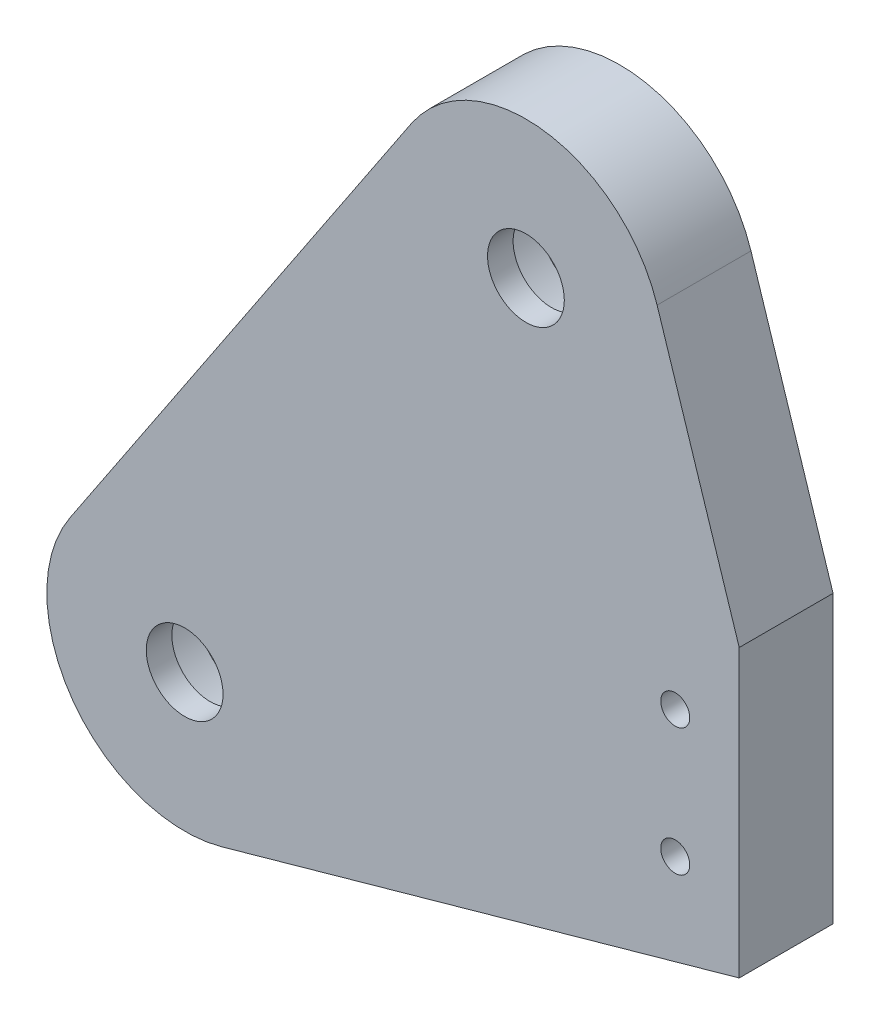
ISO-10303-21;
HEADER;
FILE_DESCRIPTION(('STEP AP214'),'2;1');
FILE_NAME('part.step','',(''),(''),'','','');
FILE_SCHEMA(('AUTOMOTIVE_DESIGN { 1 0 10303 214 1 1 1 1 }'));
ENDSEC;
DATA;
#1=APPLICATION_CONTEXT('core data for automotive mechanical design processes');
#2=APPLICATION_PROTOCOL_DEFINITION('international standard','automotive_design',2000,#1);
#3=PRODUCT_CONTEXT('',#1,'mechanical');
#4=PRODUCT('Part','Part','',(#3));
#5=PRODUCT_RELATED_PRODUCT_CATEGORY('part','',(#4));
#6=PRODUCT_DEFINITION_FORMATION('','',#4);
#7=PRODUCT_DEFINITION_CONTEXT('part definition',#1,'design');
#8=PRODUCT_DEFINITION('design','',#6,#7);
#9=PRODUCT_DEFINITION_SHAPE('','',#8);
#10=(LENGTH_UNIT() NAMED_UNIT(*) SI_UNIT(.MILLI.,.METRE.));
#11=(NAMED_UNIT(*) PLANE_ANGLE_UNIT() SI_UNIT($,.RADIAN.));
#12=(NAMED_UNIT(*) SI_UNIT($,.STERADIAN.) SOLID_ANGLE_UNIT());
#13=UNCERTAINTY_MEASURE_WITH_UNIT(LENGTH_MEASURE(1.E-05),#10,'distance_accuracy_value','');
#14=(GEOMETRIC_REPRESENTATION_CONTEXT(3) GLOBAL_UNCERTAINTY_ASSIGNED_CONTEXT((#13)) GLOBAL_UNIT_ASSIGNED_CONTEXT((#10,
#11,#12)) REPRESENTATION_CONTEXT('',''));
#15=CARTESIAN_POINT('',(0.,0.,0.));
#16=DIRECTION('',(0.,0.,1.));
#17=DIRECTION('',(1.,0.,0.));
#18=AXIS2_PLACEMENT_3D('',#15,#16,#17);
#19=CARTESIAN_POINT('',(55.3751851278346,64.9422851278346,-8.));
#20=DIRECTION('',(0.952023846924741,0.306023846924741,0.));
#21=DIRECTION('',(-0.306023846924741,0.952023846924741,0.));
#22=AXIS2_PLACEMENT_3D('',#19,#20,#21);
#23=PLANE('',#22);
#24=DIRECTION('',(0.,0.,1.));
#25=VECTOR('',#24,1.);
#26=CARTESIAN_POINT('',(55.3751851278346,64.9422851278346,-8.));
#27=LINE('',#26,#25);
#28=CARTESIAN_POINT('',(55.3751851278346,64.9422851278346,-8.));
#29=VERTEX_POINT('',#28);
#30=CARTESIAN_POINT('',(55.3751851278346,64.9422851278346,3.));
#31=VERTEX_POINT('',#30);
#32=EDGE_CURVE('E41',#29,#31,#27,.T.);
#33=ORIENTED_EDGE('',*,*,#32,.T.);
#34=DIRECTION('',(-0.306023846924741,0.952023846924741,0.));
#35=VECTOR('',#34,1.);
#36=CARTESIAN_POINT('',(65.,35.,3.));
#37=LINE('',#36,#35);
#38=CARTESIAN_POINT('',(65.,35.,3.));
#39=VERTEX_POINT('',#38);
#40=EDGE_CURVE('E90',#39,#31,#37,.T.);
#41=ORIENTED_EDGE('',*,*,#40,.F.);
#42=DIRECTION('',(0.,0.,1.));
#43=VECTOR('',#42,1.);
#44=CARTESIAN_POINT('',(65.,35.,-8.));
#45=LINE('',#44,#43);
#46=CARTESIAN_POINT('',(65.,35.,-8.));
#47=VERTEX_POINT('',#46);
#48=EDGE_CURVE('E11',#47,#39,#45,.T.);
#49=ORIENTED_EDGE('',*,*,#48,.F.);
#50=DIRECTION('',(-0.306023846924741,0.952023846924741,0.));
#51=VECTOR('',#50,1.);
#52=CARTESIAN_POINT('',(55.3751851278346,64.9422851278346,-8.));
#53=LINE('',#52,#51);
#54=EDGE_CURVE('E91',#47,#29,#53,.T.);
#55=ORIENTED_EDGE('',*,*,#54,.T.);
#56=EDGE_LOOP('',(#33,#41,#49,#55));
#57=FACE_BOUND('',#56,.T.);
#58=ADVANCED_FACE('F38',(#57),#23,.T.);
#59=CARTESIAN_POINT('',(65.,1.45410217071159,-8.));
#60=DIRECTION('',(1.,0.,0.));
#61=DIRECTION('',(0.,0.,-1.));
#62=AXIS2_PLACEMENT_3D('',#59,#60,#61);
#63=PLANE('',#62);
#64=ORIENTED_EDGE('',*,*,#48,.T.);
#65=DIRECTION('',(0.,1.,0.));
#66=VECTOR('',#65,1.);
#67=CARTESIAN_POINT('',(65.,1.45410217071159,3.));
#68=LINE('',#67,#66);
#69=CARTESIAN_POINT('',(65.,1.45410217071159,3.));
#70=VERTEX_POINT('',#69);
#71=EDGE_CURVE('E109',#70,#39,#68,.T.);
#72=ORIENTED_EDGE('',*,*,#71,.F.);
#73=DIRECTION('',(0.,0.,1.));
#74=VECTOR('',#73,1.);
#75=CARTESIAN_POINT('',(65.,1.45410217071159,-8.));
#76=LINE('',#75,#74);
#77=CARTESIAN_POINT('',(65.,1.45410217071159,-8.));
#78=VERTEX_POINT('',#77);
#79=EDGE_CURVE('E46',#78,#70,#76,.T.);
#80=ORIENTED_EDGE('',*,*,#79,.F.);
#81=DIRECTION('',(0.,1.,0.));
#82=VECTOR('',#81,1.);
#83=CARTESIAN_POINT('',(65.,1.45410217071159,-8.));
#84=LINE('',#83,#82);
#85=EDGE_CURVE('E96',#78,#47,#84,.T.);
#86=ORIENTED_EDGE('',*,*,#85,.T.);
#87=EDGE_LOOP('',(#64,#72,#80,#86));
#88=FACE_BOUND('',#87,.T.);
#89=ADVANCED_FACE('F172',(#88),#63,.T.);
#90=CARTESIAN_POINT('',(4.36052402078439,-15.550187467171,-8.));
#91=DIRECTION('',(0.270001487355071,-0.962859905087988,0.));
#92=DIRECTION('',(0.962859905087988,0.270001487355071,0.));
#93=AXIS2_PLACEMENT_3D('',#90,#91,#92);
#94=PLANE('',#93);
#95=ORIENTED_EDGE('',*,*,#79,.T.);
#96=DIRECTION('',(0.962859905087988,0.270001487355071,0.));
#97=VECTOR('',#96,1.);
#98=CARTESIAN_POINT('',(4.36052402078439,-15.550187467171,3.));
#99=LINE('',#98,#97);
#100=CARTESIAN_POINT('',(4.36052402078439,-15.550187467171,3.));
#101=VERTEX_POINT('',#100);
#102=EDGE_CURVE('E121',#101,#70,#99,.T.);
#103=ORIENTED_EDGE('',*,*,#102,.F.);
#104=DIRECTION('',(0.,0.,1.));
#105=VECTOR('',#104,1.);
#106=CARTESIAN_POINT('',(4.36052402078439,-15.550187467171,-8.));
#107=LINE('',#106,#105);
#108=CARTESIAN_POINT('',(4.36052402078439,-15.550187467171,-8.));
#109=VERTEX_POINT('',#108);
#110=EDGE_CURVE('E155',#109,#101,#107,.T.);
#111=ORIENTED_EDGE('',*,*,#110,.F.);
#112=DIRECTION('',(0.962859905087988,0.270001487355071,0.));
#113=VECTOR('',#112,1.);
#114=CARTESIAN_POINT('',(4.36052402078439,-15.550187467171,-8.));
#115=LINE('',#114,#113);
#116=EDGE_CURVE('E151',#109,#78,#115,.T.);
#117=ORIENTED_EDGE('',*,*,#116,.T.);
#118=EDGE_LOOP('',(#95,#103,#111,#117));
#119=FACE_BOUND('',#118,.T.);
#120=ADVANCED_FACE('F168',(#119),#94,.T.);
#121=CARTESIAN_POINT('',(0.,0.,-8.));
#122=DIRECTION('',(0.,0.,1.));
#123=DIRECTION('',(1.,0.,0.));
#124=AXIS2_PLACEMENT_3D('',#121,#122,#123);
#125=CYLINDRICAL_SURFACE('',#124,16.15);
#126=ORIENTED_EDGE('',*,*,#110,.T.);
#127=CARTESIAN_POINT('',(0.,0.,3.));
#128=DIRECTION('',(0.,0.,1.));
#129=DIRECTION('',(1.,0.,0.));
#130=AXIS2_PLACEMENT_3D('',#127,#128,#129);
#131=CIRCLE('',#130,16.15);
#132=CARTESIAN_POINT('',(-13.4376122535562,8.95840816903745,3.));
#133=VERTEX_POINT('',#132);
#134=EDGE_CURVE('E118',#133,#101,#131,.T.);
#135=ORIENTED_EDGE('',*,*,#134,.F.);
#136=DIRECTION('',(0.,0.,1.));
#137=VECTOR('',#136,1.);
#138=CARTESIAN_POINT('',(-13.4376122535562,8.95840816903745,-8.));
#139=LINE('',#138,#137);
#140=CARTESIAN_POINT('',(-13.4376122535562,8.95840816903745,-8.));
#141=VERTEX_POINT('',#140);
#142=EDGE_CURVE('E157',#141,#133,#139,.T.);
#143=ORIENTED_EDGE('',*,*,#142,.F.);
#144=CARTESIAN_POINT('',(0.,0.,-8.));
#145=DIRECTION('',(0.,0.,1.));
#146=DIRECTION('',(1.,0.,0.));
#147=AXIS2_PLACEMENT_3D('',#144,#145,#146);
#148=CIRCLE('',#147,16.15);
#149=EDGE_CURVE('E148',#141,#109,#148,.T.);
#150=ORIENTED_EDGE('',*,*,#149,.T.);
#151=EDGE_LOOP('',(#126,#135,#143,#150));
#152=FACE_BOUND('',#151,.T.);
#153=ADVANCED_FACE('F165',(#152),#125,.T.);
#154=CARTESIAN_POINT('',(26.5623877464438,68.9584081690375,-8.));
#155=DIRECTION('',(-0.832050294337844,0.554700196225229,0.));
#156=DIRECTION('',(-0.554700196225229,-0.832050294337844,0.));
#157=AXIS2_PLACEMENT_3D('',#154,#155,#156);
#158=PLANE('',#157);
#159=ORIENTED_EDGE('',*,*,#142,.T.);
#160=DIRECTION('',(-0.554700196225229,-0.832050294337844,0.));
#161=VECTOR('',#160,1.);
#162=CARTESIAN_POINT('',(26.5623877464438,68.9584081690375,3.));
#163=LINE('',#162,#161);
#164=CARTESIAN_POINT('',(26.5623877464438,68.9584081690375,3.));
#165=VERTEX_POINT('',#164);
#166=EDGE_CURVE('E103',#165,#133,#163,.T.);
#167=ORIENTED_EDGE('',*,*,#166,.F.);
#168=DIRECTION('',(0.,0.,1.));
#169=VECTOR('',#168,1.);
#170=CARTESIAN_POINT('',(26.5623877464438,68.9584081690375,-8.));
#171=LINE('',#170,#169);
#172=CARTESIAN_POINT('',(26.5623877464438,68.9584081690375,-8.));
#173=VERTEX_POINT('',#172);
#174=EDGE_CURVE('E95',#173,#165,#171,.T.);
#175=ORIENTED_EDGE('',*,*,#174,.F.);
#176=DIRECTION('',(-0.554700196225229,-0.832050294337844,0.));
#177=VECTOR('',#176,1.);
#178=CARTESIAN_POINT('',(26.5623877464438,68.9584081690375,-8.));
#179=LINE('',#178,#177);
#180=EDGE_CURVE('E145',#173,#141,#179,.T.);
#181=ORIENTED_EDGE('',*,*,#180,.T.);
#182=EDGE_LOOP('',(#159,#167,#175,#181));
#183=FACE_BOUND('',#182,.T.);
#184=ADVANCED_FACE('F159',(#183),#158,.T.);
#185=CARTESIAN_POINT('',(40.,60.,-8.));
#186=DIRECTION('',(0.,0.,1.));
#187=DIRECTION('',(1.,0.,0.));
#188=AXIS2_PLACEMENT_3D('',#185,#186,#187);
#189=CYLINDRICAL_SURFACE('',#188,16.15);
#190=ORIENTED_EDGE('',*,*,#174,.T.);
#191=CARTESIAN_POINT('',(40.,60.,3.));
#192=DIRECTION('',(0.,0.,1.));
#193=DIRECTION('',(1.,0.,0.));
#194=AXIS2_PLACEMENT_3D('',#191,#192,#193);
#195=CIRCLE('',#194,16.15);
#196=EDGE_CURVE('E98',#31,#165,#195,.T.);
#197=ORIENTED_EDGE('',*,*,#196,.F.);
#198=ORIENTED_EDGE('',*,*,#32,.F.);
#199=CARTESIAN_POINT('',(40.,60.,-8.));
#200=DIRECTION('',(0.,0.,1.));
#201=DIRECTION('',(1.,0.,0.));
#202=AXIS2_PLACEMENT_3D('',#199,#200,#201);
#203=CIRCLE('',#202,16.15);
#204=EDGE_CURVE('E143',#29,#173,#203,.T.);
#205=ORIENTED_EDGE('',*,*,#204,.T.);
#206=EDGE_LOOP('',(#190,#197,#198,#205));
#207=FACE_BOUND('',#206,.T.);
#208=ADVANCED_FACE('F99',(#207),#189,.T.);
#209=CARTESIAN_POINT('',(0.,0.,-8.));
#210=DIRECTION('',(0.,0.,1.));
#211=DIRECTION('',(1.,0.,0.));
#212=AXIS2_PLACEMENT_3D('',#209,#210,#211);
#213=PLANE('',#212);
#214=CARTESIAN_POINT('',(40.,60.,-8.));
#215=DIRECTION('',(0.,0.,1.));
#216=DIRECTION('',(1.,0.,0.));
#217=AXIS2_PLACEMENT_3D('',#214,#215,#216);
#218=CIRCLE('',#217,11.15);
#219=CARTESIAN_POINT('',(51.15,60.,-8.));
#220=VERTEX_POINT('',#219);
#221=EDGE_CURVE('E125',#220,#220,#218,.T.);
#222=ORIENTED_EDGE('',*,*,#221,.T.);
#223=EDGE_LOOP('',(#222));
#224=FACE_BOUND('',#223,.T.);
#225=CARTESIAN_POINT('',(57.5,10.0333333333333,-8.));
#226=DIRECTION('',(0.,0.,1.));
#227=DIRECTION('',(1.,0.,0.));
#228=AXIS2_PLACEMENT_3D('',#225,#226,#227);
#229=CIRCLE('',#228,1.7);
#230=CARTESIAN_POINT('',(59.2,10.0333333333333,-8.));
#231=VERTEX_POINT('',#230);
#232=EDGE_CURVE('E128',#231,#231,#229,.T.);
#233=ORIENTED_EDGE('',*,*,#232,.T.);
#234=EDGE_LOOP('',(#233));
#235=FACE_BOUND('',#234,.T.);
#236=CARTESIAN_POINT('',(57.5,24.9666666666667,-8.));
#237=DIRECTION('',(0.,0.,1.));
#238=DIRECTION('',(1.,0.,0.));
#239=AXIS2_PLACEMENT_3D('',#236,#237,#238);
#240=CIRCLE('',#239,1.7);
#241=CARTESIAN_POINT('',(59.2,24.9666666666667,-8.));
#242=VERTEX_POINT('',#241);
#243=EDGE_CURVE('E134',#242,#242,#240,.T.);
#244=ORIENTED_EDGE('',*,*,#243,.T.);
#245=EDGE_LOOP('',(#244));
#246=FACE_BOUND('',#245,.T.);
#247=CARTESIAN_POINT('',(0.,0.,-8.));
#248=DIRECTION('',(0.,0.,1.));
#249=DIRECTION('',(1.,0.,0.));
#250=AXIS2_PLACEMENT_3D('',#247,#248,#249);
#251=CIRCLE('',#250,11.15);
#252=CARTESIAN_POINT('',(11.15,0.,-8.));
#253=VERTEX_POINT('',#252);
#254=EDGE_CURVE('E137',#253,#253,#251,.T.);
#255=ORIENTED_EDGE('',*,*,#254,.T.);
#256=EDGE_LOOP('',(#255));
#257=FACE_BOUND('',#256,.T.);
#258=ORIENTED_EDGE('',*,*,#54,.F.);
#259=ORIENTED_EDGE('',*,*,#85,.F.);
#260=ORIENTED_EDGE('',*,*,#116,.F.);
#261=ORIENTED_EDGE('',*,*,#149,.F.);
#262=ORIENTED_EDGE('',*,*,#180,.F.);
#263=ORIENTED_EDGE('',*,*,#204,.F.);
#264=EDGE_LOOP('',(#258,#259,#260,#261,#262,#263));
#265=FACE_BOUND('',#264,.T.);
#266=ADVANCED_FACE('F171',(#224,#235,#246,#257,#265),#213,.F.);
#267=CARTESIAN_POINT('',(0.,0.,-8.));
#268=DIRECTION('',(0.,0.,1.));
#269=DIRECTION('',(1.,0.,0.));
#270=AXIS2_PLACEMENT_3D('',#267,#268,#269);
#271=CYLINDRICAL_SURFACE('',#270,11.15);
#272=ORIENTED_EDGE('',*,*,#254,.F.);
#273=EDGE_LOOP('',(#272));
#274=FACE_BOUND('',#273,.T.);
#275=CARTESIAN_POINT('',(0.,0.,0.));
#276=DIRECTION('',(0.,0.,1.));
#277=DIRECTION('',(1.,0.,0.));
#278=AXIS2_PLACEMENT_3D('',#275,#276,#277);
#279=CIRCLE('',#278,11.15);
#280=CARTESIAN_POINT('',(11.15,0.,0.));
#281=VERTEX_POINT('',#280);
#282=EDGE_CURVE('E124',#281,#281,#279,.T.);
#283=ORIENTED_EDGE('',*,*,#282,.T.);
#284=EDGE_LOOP('',(#283));
#285=FACE_BOUND('',#284,.T.);
#286=ADVANCED_FACE('F191',(#274,#285),#271,.F.);
#287=CARTESIAN_POINT('',(57.5,24.9666666666667,-8.));
#288=DIRECTION('',(0.,0.,1.));
#289=DIRECTION('',(1.,0.,0.));
#290=AXIS2_PLACEMENT_3D('',#287,#288,#289);
#291=CYLINDRICAL_SURFACE('',#290,1.7);
#292=ORIENTED_EDGE('',*,*,#243,.F.);
#293=EDGE_LOOP('',(#292));
#294=FACE_BOUND('',#293,.T.);
#295=CARTESIAN_POINT('',(57.5,24.9666666666667,3.));
#296=DIRECTION('',(0.,0.,1.));
#297=DIRECTION('',(1.,0.,0.));
#298=AXIS2_PLACEMENT_3D('',#295,#296,#297);
#299=CIRCLE('',#298,1.7);
#300=CARTESIAN_POINT('',(59.2,24.9666666666667,3.));
#301=VERTEX_POINT('',#300);
#302=EDGE_CURVE('E238',#301,#301,#299,.T.);
#303=ORIENTED_EDGE('',*,*,#302,.T.);
#304=EDGE_LOOP('',(#303));
#305=FACE_BOUND('',#304,.T.);
#306=ADVANCED_FACE('F196',(#294,#305),#291,.F.);
#307=CARTESIAN_POINT('',(57.5,10.0333333333333,-8.));
#308=DIRECTION('',(0.,0.,1.));
#309=DIRECTION('',(1.,0.,0.));
#310=AXIS2_PLACEMENT_3D('',#307,#308,#309);
#311=CYLINDRICAL_SURFACE('',#310,1.7);
#312=ORIENTED_EDGE('',*,*,#232,.F.);
#313=EDGE_LOOP('',(#312));
#314=FACE_BOUND('',#313,.T.);
#315=CARTESIAN_POINT('',(57.5,10.0333333333333,3.));
#316=DIRECTION('',(0.,0.,1.));
#317=DIRECTION('',(1.,0.,0.));
#318=AXIS2_PLACEMENT_3D('',#315,#316,#317);
#319=CIRCLE('',#318,1.7);
#320=CARTESIAN_POINT('',(59.2,10.0333333333333,3.));
#321=VERTEX_POINT('',#320);
#322=EDGE_CURVE('E239',#321,#321,#319,.T.);
#323=ORIENTED_EDGE('',*,*,#322,.T.);
#324=EDGE_LOOP('',(#323));
#325=FACE_BOUND('',#324,.T.);
#326=ADVANCED_FACE('F227',(#314,#325),#311,.F.);
#327=CARTESIAN_POINT('',(40.,60.,-8.));
#328=DIRECTION('',(0.,0.,1.));
#329=DIRECTION('',(1.,0.,0.));
#330=AXIS2_PLACEMENT_3D('',#327,#328,#329);
#331=CYLINDRICAL_SURFACE('',#330,11.15);
#332=ORIENTED_EDGE('',*,*,#221,.F.);
#333=EDGE_LOOP('',(#332));
#334=FACE_BOUND('',#333,.T.);
#335=CARTESIAN_POINT('',(40.,60.,0.));
#336=DIRECTION('',(0.,0.,1.));
#337=DIRECTION('',(1.,0.,0.));
#338=AXIS2_PLACEMENT_3D('',#335,#336,#337);
#339=CIRCLE('',#338,11.15);
#340=CARTESIAN_POINT('',(51.15,60.,0.));
#341=VERTEX_POINT('',#340);
#342=EDGE_CURVE('E129',#341,#341,#339,.T.);
#343=ORIENTED_EDGE('',*,*,#342,.T.);
#344=EDGE_LOOP('',(#343));
#345=FACE_BOUND('',#344,.T.);
#346=ADVANCED_FACE('F220',(#334,#345),#331,.F.);
#347=CARTESIAN_POINT('',(40.,60.,0.));
#348=DIRECTION('',(0.,0.,1.));
#349=DIRECTION('',(1.,0.,0.));
#350=AXIS2_PLACEMENT_3D('',#347,#348,#349);
#351=PLANE('',#350);
#352=CARTESIAN_POINT('',(40.,60.,0.));
#353=DIRECTION('',(0.,0.,1.));
#354=DIRECTION('',(1.,0.,0.));
#355=AXIS2_PLACEMENT_3D('',#352,#353,#354);
#356=CIRCLE('',#355,4.5);
#357=CARTESIAN_POINT('',(44.5,60.,0.));
#358=VERTEX_POINT('',#357);
#359=EDGE_CURVE('E245',#358,#358,#356,.T.);
#360=ORIENTED_EDGE('',*,*,#359,.T.);
#361=EDGE_LOOP('',(#360));
#362=FACE_BOUND('',#361,.T.);
#363=ORIENTED_EDGE('',*,*,#342,.F.);
#364=EDGE_LOOP('',(#363));
#365=FACE_BOUND('',#364,.T.);
#366=ADVANCED_FACE('F210',(#362,#365),#351,.F.);
#367=CARTESIAN_POINT('',(0.,0.,0.));
#368=DIRECTION('',(0.,0.,1.));
#369=DIRECTION('',(1.,0.,0.));
#370=AXIS2_PLACEMENT_3D('',#367,#368,#369);
#371=CIRCLE('',#370,4.5);
#372=CARTESIAN_POINT('',(4.5,0.,0.));
#373=VERTEX_POINT('',#372);
#374=EDGE_CURVE('E113',#373,#373,#371,.T.);
#375=ORIENTED_EDGE('',*,*,#374,.T.);
#376=EDGE_LOOP('',(#375));
#377=FACE_BOUND('',#376,.T.);
#378=ORIENTED_EDGE('',*,*,#282,.F.);
#379=EDGE_LOOP('',(#378));
#380=FACE_BOUND('',#379,.T.);
#381=ADVANCED_FACE('F208',(#377,#380),#351,.F.);
#382=CARTESIAN_POINT('',(40.,60.,3.));
#383=DIRECTION('',(0.,0.,1.));
#384=DIRECTION('',(1.,0.,0.));
#385=AXIS2_PLACEMENT_3D('',#382,#383,#384);
#386=PLANE('',#385);
#387=ORIENTED_EDGE('',*,*,#322,.F.);
#388=EDGE_LOOP('',(#387));
#389=FACE_BOUND('',#388,.T.);
#390=CARTESIAN_POINT('',(0.,0.,3.));
#391=DIRECTION('',(0.,0.,1.));
#392=DIRECTION('',(1.,0.,0.));
#393=AXIS2_PLACEMENT_3D('',#390,#391,#392);
#394=CIRCLE('',#393,4.5);
#395=CARTESIAN_POINT('',(4.5,0.,3.));
#396=VERTEX_POINT('',#395);
#397=EDGE_CURVE('E110',#396,#396,#394,.T.);
#398=ORIENTED_EDGE('',*,*,#397,.F.);
#399=EDGE_LOOP('',(#398));
#400=FACE_BOUND('',#399,.T.);
#401=ORIENTED_EDGE('',*,*,#40,.T.);
#402=ORIENTED_EDGE('',*,*,#196,.T.);
#403=ORIENTED_EDGE('',*,*,#166,.T.);
#404=ORIENTED_EDGE('',*,*,#134,.T.);
#405=ORIENTED_EDGE('',*,*,#102,.T.);
#406=ORIENTED_EDGE('',*,*,#71,.T.);
#407=EDGE_LOOP('',(#401,#402,#403,#404,#405,#406));
#408=FACE_BOUND('',#407,.T.);
#409=ORIENTED_EDGE('',*,*,#302,.F.);
#410=EDGE_LOOP('',(#409));
#411=FACE_BOUND('',#410,.T.);
#412=CARTESIAN_POINT('',(40.,60.,3.));
#413=DIRECTION('',(0.,0.,1.));
#414=DIRECTION('',(1.,0.,0.));
#415=AXIS2_PLACEMENT_3D('',#412,#413,#414);
#416=CIRCLE('',#415,4.5);
#417=CARTESIAN_POINT('',(44.5,60.,3.));
#418=VERTEX_POINT('',#417);
#419=EDGE_CURVE('E242',#418,#418,#416,.T.);
#420=ORIENTED_EDGE('',*,*,#419,.F.);
#421=EDGE_LOOP('',(#420));
#422=FACE_BOUND('',#421,.T.);
#423=ADVANCED_FACE('F106',(#389,#400,#408,#411,#422),#386,.T.);
#424=CARTESIAN_POINT('',(0.,0.,3.));
#425=DIRECTION('',(0.,0.,-1.));
#426=DIRECTION('',(-1.,0.,0.));
#427=AXIS2_PLACEMENT_3D('',#424,#425,#426);
#428=CYLINDRICAL_SURFACE('',#427,4.5);
#429=ORIENTED_EDGE('',*,*,#397,.T.);
#430=EDGE_LOOP('',(#429));
#431=FACE_BOUND('',#430,.T.);
#432=ORIENTED_EDGE('',*,*,#374,.F.);
#433=EDGE_LOOP('',(#432));
#434=FACE_BOUND('',#433,.T.);
#435=ADVANCED_FACE('F217',(#431,#434),#428,.F.);
#436=CARTESIAN_POINT('',(40.,60.,3.));
#437=DIRECTION('',(0.,0.,-1.));
#438=DIRECTION('',(-1.,0.,0.));
#439=AXIS2_PLACEMENT_3D('',#436,#437,#438);
#440=CYLINDRICAL_SURFACE('',#439,4.5);
#441=ORIENTED_EDGE('',*,*,#419,.T.);
#442=EDGE_LOOP('',(#441));
#443=FACE_BOUND('',#442,.T.);
#444=ORIENTED_EDGE('',*,*,#359,.F.);
#445=EDGE_LOOP('',(#444));
#446=FACE_BOUND('',#445,.T.);
#447=ADVANCED_FACE('F251',(#443,#446),#440,.F.);
#448=CLOSED_SHELL('',(#58,#89,#120,#153,#184,#208,#266,#286,#306,#326,#346,#366,#381,#423,#435,#447));
#449=MANIFOLD_SOLID_BREP('B2',#448);
#450=ADVANCED_BREP_SHAPE_REPRESENTATION('',(#18,#449),#14);
#451=SHAPE_DEFINITION_REPRESENTATION(#9,#450);
ENDSEC;
END-ISO-10303-21;
